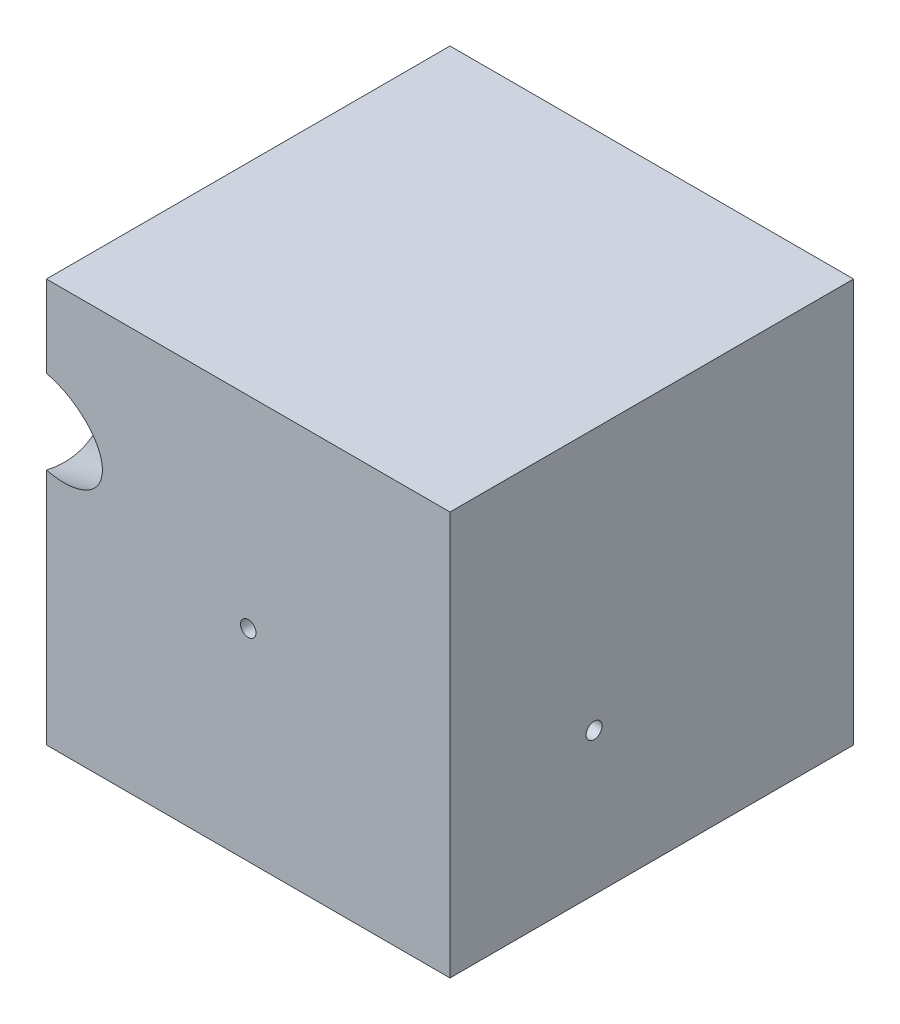
ISO-10303-21;
HEADER;
FILE_DESCRIPTION(('STEP AP214'),'2;1');
FILE_NAME('part.step','',(''),(''),'','','');
FILE_SCHEMA(('AUTOMOTIVE_DESIGN { 1 0 10303 214 1 1 1 1 }'));
ENDSEC;
DATA;
#1=APPLICATION_CONTEXT('core data for automotive mechanical design processes');
#2=APPLICATION_PROTOCOL_DEFINITION('international standard','automotive_design',2000,#1);
#3=PRODUCT_CONTEXT('',#1,'mechanical');
#4=PRODUCT('Part','Part','',(#3));
#5=PRODUCT_RELATED_PRODUCT_CATEGORY('part','',(#4));
#6=PRODUCT_DEFINITION_FORMATION('','',#4);
#7=PRODUCT_DEFINITION_CONTEXT('part definition',#1,'design');
#8=PRODUCT_DEFINITION('design','',#6,#7);
#9=PRODUCT_DEFINITION_SHAPE('','',#8);
#10=(LENGTH_UNIT() NAMED_UNIT(*) SI_UNIT(.MILLI.,.METRE.));
#11=(NAMED_UNIT(*) PLANE_ANGLE_UNIT() SI_UNIT($,.RADIAN.));
#12=(NAMED_UNIT(*) SI_UNIT($,.STERADIAN.) SOLID_ANGLE_UNIT());
#13=UNCERTAINTY_MEASURE_WITH_UNIT(LENGTH_MEASURE(1.E-05),#10,'distance_accuracy_value','');
#14=(GEOMETRIC_REPRESENTATION_CONTEXT(3) GLOBAL_UNCERTAINTY_ASSIGNED_CONTEXT((#13)) GLOBAL_UNIT_ASSIGNED_CONTEXT((#10,
#11,#12)) REPRESENTATION_CONTEXT('',''));
#15=CARTESIAN_POINT('',(0.,0.,0.));
#16=DIRECTION('',(0.,0.,1.));
#17=DIRECTION('',(1.,0.,0.));
#18=AXIS2_PLACEMENT_3D('',#15,#16,#17);
#19=CARTESIAN_POINT('',(26.,-26.,52.));
#20=DIRECTION('',(-1.,0.,0.));
#21=DIRECTION('',(0.,0.,1.));
#22=AXIS2_PLACEMENT_3D('',#19,#20,#21);
#23=PLANE('',#22);
#24=CARTESIAN_POINT('',(26.,-7.65059971868936,33.4398847970418));
#25=DIRECTION('',(1.,0.,0.));
#26=DIRECTION('',(0.,0.,-1.));
#27=AXIS2_PLACEMENT_3D('',#24,#25,#26);
#28=CIRCLE('',#27,1.03066779328189);
#29=CARTESIAN_POINT('',(26.,-7.65059971868936,32.4092170037599));
#30=VERTEX_POINT('',#29);
#31=EDGE_CURVE('E157',#30,#30,#28,.T.);
#32=ORIENTED_EDGE('',*,*,#31,.F.);
#33=EDGE_LOOP('',(#32));
#34=FACE_BOUND('',#33,.T.);
#35=DIRECTION('',(0.,1.,0.));
#36=VECTOR('',#35,1.);
#37=CARTESIAN_POINT('',(26.,-26.,0.));
#38=LINE('',#37,#36);
#39=CARTESIAN_POINT('',(26.,-26.,0.));
#40=VERTEX_POINT('',#39);
#41=CARTESIAN_POINT('',(26.,26.,0.));
#42=VERTEX_POINT('',#41);
#43=EDGE_CURVE('E98',#40,#42,#38,.T.);
#44=ORIENTED_EDGE('',*,*,#43,.T.);
#45=DIRECTION('',(0.,0.,-1.));
#46=VECTOR('',#45,1.);
#47=CARTESIAN_POINT('',(26.,26.,52.));
#48=LINE('',#47,#46);
#49=CARTESIAN_POINT('',(26.,26.,52.));
#50=VERTEX_POINT('',#49);
#51=EDGE_CURVE('E43',#50,#42,#48,.T.);
#52=ORIENTED_EDGE('',*,*,#51,.F.);
#53=DIRECTION('',(0.,1.,0.));
#54=VECTOR('',#53,1.);
#55=CARTESIAN_POINT('',(26.,-26.,52.));
#56=LINE('',#55,#54);
#57=CARTESIAN_POINT('',(26.,-26.,52.));
#58=VERTEX_POINT('',#57);
#59=EDGE_CURVE('E115',#58,#50,#56,.T.);
#60=ORIENTED_EDGE('',*,*,#59,.F.);
#61=DIRECTION('',(0.,0.,-1.));
#62=VECTOR('',#61,1.);
#63=CARTESIAN_POINT('',(26.,-26.,52.));
#64=LINE('',#63,#62);
#65=EDGE_CURVE('E103',#58,#40,#64,.T.);
#66=ORIENTED_EDGE('',*,*,#65,.T.);
#67=EDGE_LOOP('',(#44,#52,#60,#66));
#68=FACE_BOUND('',#67,.T.);
#69=ADVANCED_FACE('F36',(#34,#68),#23,.F.);
#70=CARTESIAN_POINT('',(-26.,26.,52.));
#71=DIRECTION('',(0.,-1.,0.));
#72=DIRECTION('',(0.,0.,-1.));
#73=AXIS2_PLACEMENT_3D('',#70,#71,#72);
#74=PLANE('',#73);
#75=DIRECTION('',(-1.,0.,0.));
#76=VECTOR('',#75,1.);
#77=CARTESIAN_POINT('',(-26.,26.,0.));
#78=LINE('',#77,#76);
#79=CARTESIAN_POINT('',(-26.,26.,0.));
#80=VERTEX_POINT('',#79);
#81=EDGE_CURVE('E110',#42,#80,#78,.T.);
#82=ORIENTED_EDGE('',*,*,#81,.T.);
#83=DIRECTION('',(0.,0.,-1.));
#84=VECTOR('',#83,1.);
#85=CARTESIAN_POINT('',(-26.,26.,52.));
#86=LINE('',#85,#84);
#87=CARTESIAN_POINT('',(-26.,26.,52.));
#88=VERTEX_POINT('',#87);
#89=EDGE_CURVE('E119',#88,#80,#86,.T.);
#90=ORIENTED_EDGE('',*,*,#89,.F.);
#91=DIRECTION('',(-1.,0.,0.));
#92=VECTOR('',#91,1.);
#93=CARTESIAN_POINT('',(-26.,26.,52.));
#94=LINE('',#93,#92);
#95=EDGE_CURVE('E86',#50,#88,#94,.T.);
#96=ORIENTED_EDGE('',*,*,#95,.F.);
#97=ORIENTED_EDGE('',*,*,#51,.T.);
#98=EDGE_LOOP('',(#82,#90,#96,#97));
#99=FACE_BOUND('',#98,.T.);
#100=ADVANCED_FACE('F121',(#99),#74,.F.);
#101=CARTESIAN_POINT('',(-26.,-26.,52.));
#102=DIRECTION('',(1.,0.,0.));
#103=DIRECTION('',(0.,0.,-1.));
#104=AXIS2_PLACEMENT_3D('',#101,#102,#103);
#105=PLANE('',#104);
#106=CARTESIAN_POINT('',(-26.,15.4824932695756,10.5144089828936));
#107=DIRECTION('',(-1.,0.,0.));
#108=DIRECTION('',(0.,0.,1.));
#109=AXIS2_PLACEMENT_3D('',#106,#107,#108);
#110=CIRCLE('',#109,1.);
#111=CARTESIAN_POINT('',(-26.,15.4824932695756,11.5144089828936));
#112=VERTEX_POINT('',#111);
#113=EDGE_CURVE('E152',#112,#112,#110,.T.);
#114=ORIENTED_EDGE('',*,*,#113,.F.);
#115=EDGE_LOOP('',(#114));
#116=FACE_BOUND('',#115,.T.);
#117=CARTESIAN_POINT('',(-26.,-13.8145900133681,20.4493109872581));
#118=DIRECTION('',(-1.,0.,0.));
#119=DIRECTION('',(0.,0.,1.));
#120=AXIS2_PLACEMENT_3D('',#117,#118,#119);
#121=CIRCLE('',#120,1.);
#122=CARTESIAN_POINT('',(-26.,-13.8145900133681,21.4493109872581));
#123=VERTEX_POINT('',#122);
#124=EDGE_CURVE('E145',#123,#123,#121,.T.);
#125=ORIENTED_EDGE('',*,*,#124,.F.);
#126=EDGE_LOOP('',(#125));
#127=FACE_BOUND('',#126,.T.);
#128=DIRECTION('',(0.,-1.,0.));
#129=VECTOR('',#128,1.);
#130=CARTESIAN_POINT('',(-26.,-26.,52.));
#131=LINE('',#130,#129);
#132=CARTESIAN_POINT('',(-26.,4.68073054722557,52.));
#133=VERTEX_POINT('',#132);
#134=CARTESIAN_POINT('',(-26.,-26.,52.));
#135=VERTEX_POINT('',#134);
#136=EDGE_CURVE('E97',#133,#135,#131,.T.);
#137=ORIENTED_EDGE('',*,*,#136,.F.);
#138=CARTESIAN_POINT('',(-26.,10.0900974233027,52.));
#139=DIRECTION('',(1.,0.,0.));
#140=DIRECTION('',(0.,-0.447213595499958,-0.894427190999916));
#141=AXIS2_PLACEMENT_3D('',#138,#139,#140);
#142=ELLIPSE('',#141,7.65,5.1);
#143=CARTESIAN_POINT('',(-26.,15.4994642993798,52.));
#144=VERTEX_POINT('',#143);
#145=EDGE_CURVE('E49',#133,#144,#142,.T.);
#146=ORIENTED_EDGE('',*,*,#145,.T.);
#147=EDGE_CURVE('E95',#88,#144,#131,.T.);
#148=ORIENTED_EDGE('',*,*,#147,.F.);
#149=ORIENTED_EDGE('',*,*,#89,.T.);
#150=DIRECTION('',(0.,-1.,0.));
#151=VECTOR('',#150,1.);
#152=CARTESIAN_POINT('',(-26.,-26.,0.));
#153=LINE('',#152,#151);
#154=CARTESIAN_POINT('',(-26.,-26.,0.));
#155=VERTEX_POINT('',#154);
#156=EDGE_CURVE('E112',#80,#155,#153,.T.);
#157=ORIENTED_EDGE('',*,*,#156,.T.);
#158=DIRECTION('',(0.,0.,-1.));
#159=VECTOR('',#158,1.);
#160=CARTESIAN_POINT('',(-26.,-26.,52.));
#161=LINE('',#160,#159);
#162=EDGE_CURVE('E117',#135,#155,#161,.T.);
#163=ORIENTED_EDGE('',*,*,#162,.F.);
#164=EDGE_LOOP('',(#137,#146,#148,#149,#157,#163));
#165=FACE_BOUND('',#164,.T.);
#166=ADVANCED_FACE('F93',(#116,#127,#165),#105,.F.);
#167=CARTESIAN_POINT('',(-26.,-26.,52.));
#168=DIRECTION('',(0.,1.,0.));
#169=DIRECTION('',(0.,0.,1.));
#170=AXIS2_PLACEMENT_3D('',#167,#168,#169);
#171=PLANE('',#170);
#172=CARTESIAN_POINT('',(-9.,-26.,44.28));
#173=DIRECTION('',(0.,-1.,0.));
#174=DIRECTION('',(0.,0.,-1.));
#175=AXIS2_PLACEMENT_3D('',#172,#173,#174);
#176=CIRCLE('',#175,1.);
#177=CARTESIAN_POINT('',(-9.,-26.,43.28));
#178=VERTEX_POINT('',#177);
#179=EDGE_CURVE('E163',#178,#178,#176,.T.);
#180=ORIENTED_EDGE('',*,*,#179,.F.);
#181=EDGE_LOOP('',(#180));
#182=FACE_BOUND('',#181,.T.);
#183=DIRECTION('',(1.,0.,0.));
#184=VECTOR('',#183,1.);
#185=CARTESIAN_POINT('',(-26.,-26.,0.));
#186=LINE('',#185,#184);
#187=EDGE_CURVE('E78',#155,#40,#186,.T.);
#188=ORIENTED_EDGE('',*,*,#187,.T.);
#189=ORIENTED_EDGE('',*,*,#65,.F.);
#190=DIRECTION('',(1.,0.,0.));
#191=VECTOR('',#190,1.);
#192=CARTESIAN_POINT('',(-26.,-26.,52.));
#193=LINE('',#192,#191);
#194=EDGE_CURVE('E57',#135,#58,#193,.T.);
#195=ORIENTED_EDGE('',*,*,#194,.F.);
#196=ORIENTED_EDGE('',*,*,#162,.T.);
#197=EDGE_LOOP('',(#188,#189,#195,#196));
#198=FACE_BOUND('',#197,.T.);
#199=ADVANCED_FACE('F128',(#182,#198),#171,.F.);
#200=CARTESIAN_POINT('',(0.,0.,52.));
#201=DIRECTION('',(0.,0.,-1.));
#202=DIRECTION('',(-1.,0.,0.));
#203=AXIS2_PLACEMENT_3D('',#200,#201,#202);
#204=PLANE('',#203);
#205=CARTESIAN_POINT('',(0.,0.,52.));
#206=DIRECTION('',(0.,0.,1.));
#207=DIRECTION('',(1.,0.,0.));
#208=AXIS2_PLACEMENT_3D('',#205,#206,#207);
#209=CIRCLE('',#208,1.);
#210=CARTESIAN_POINT('',(1.,0.,52.));
#211=VERTEX_POINT('',#210);
#212=EDGE_CURVE('E133',#211,#211,#209,.T.);
#213=ORIENTED_EDGE('',*,*,#212,.F.);
#214=EDGE_LOOP('',(#213));
#215=FACE_BOUND('',#214,.T.);
#216=ORIENTED_EDGE('',*,*,#147,.T.);
#217=CARTESIAN_POINT('',(-26.,10.0900974233027,52.));
#218=DIRECTION('',(0.,0.,-1.));
#219=DIRECTION('',(0.894427190999916,-0.447213595499958,0.));
#220=AXIS2_PLACEMENT_3D('',#217,#218,#219);
#221=ELLIPSE('',#220,7.65,5.1);
#222=EDGE_CURVE('E11',#144,#133,#221,.T.);
#223=ORIENTED_EDGE('',*,*,#222,.T.);
#224=ORIENTED_EDGE('',*,*,#136,.T.);
#225=ORIENTED_EDGE('',*,*,#194,.T.);
#226=ORIENTED_EDGE('',*,*,#59,.T.);
#227=ORIENTED_EDGE('',*,*,#95,.T.);
#228=EDGE_LOOP('',(#216,#223,#224,#225,#226,#227));
#229=FACE_BOUND('',#228,.T.);
#230=ADVANCED_FACE('F101',(#215,#229),#204,.F.);
#231=CARTESIAN_POINT('',(0.,0.,0.));
#232=DIRECTION('',(0.,0.,-1.));
#233=DIRECTION('',(-1.,0.,0.));
#234=AXIS2_PLACEMENT_3D('',#231,#232,#233);
#235=PLANE('',#234);
#236=CARTESIAN_POINT('',(0.,0.,0.));
#237=DIRECTION('',(0.,0.,-1.));
#238=DIRECTION('',(-1.,0.,0.));
#239=AXIS2_PLACEMENT_3D('',#236,#237,#238);
#240=CIRCLE('',#239,1.);
#241=CARTESIAN_POINT('',(-1.,0.,0.));
#242=VERTEX_POINT('',#241);
#243=EDGE_CURVE('E139',#242,#242,#240,.T.);
#244=ORIENTED_EDGE('',*,*,#243,.F.);
#245=EDGE_LOOP('',(#244));
#246=FACE_BOUND('',#245,.T.);
#247=ORIENTED_EDGE('',*,*,#43,.F.);
#248=ORIENTED_EDGE('',*,*,#187,.F.);
#249=ORIENTED_EDGE('',*,*,#156,.F.);
#250=ORIENTED_EDGE('',*,*,#81,.F.);
#251=EDGE_LOOP('',(#247,#248,#249,#250));
#252=FACE_BOUND('',#251,.T.);
#253=ADVANCED_FACE('F126',(#246,#252),#235,.T.);
#254=CARTESIAN_POINT('',(-29.5355339059327,11.857864376269,55.5355339059327));
#255=DIRECTION('',(0.666666666666667,-0.333333333333333,-0.666666666666667));
#256=DIRECTION('',(-0.707106781186548,0.,-0.707106781186548));
#257=AXIS2_PLACEMENT_3D('',#254,#255,#256);
#258=CYLINDRICAL_SURFACE('',#257,5.1);
#259=CARTESIAN_POINT('',(-7.97997835037718,1.08008659849128,33.9799783503772));
#260=DIRECTION('',(0.666666666666667,-0.333333333333333,-0.666666666666667));
#261=DIRECTION('',(-0.707106781186548,0.,-0.707106781186548));
#262=AXIS2_PLACEMENT_3D('',#259,#260,#261);
#263=CIRCLE('',#262,5.1);
#264=CARTESIAN_POINT('',(-11.5862229344286,1.08008659849128,30.3737337663258));
#265=VERTEX_POINT('',#264);
#266=EDGE_CURVE('E99',#265,#265,#263,.T.);
#267=ORIENTED_EDGE('',*,*,#266,.T.);
#268=EDGE_LOOP('',(#267));
#269=FACE_BOUND('',#268,.T.);
#270=ORIENTED_EDGE('',*,*,#222,.F.);
#271=ORIENTED_EDGE('',*,*,#145,.F.);
#272=EDGE_LOOP('',(#270,#271));
#273=FACE_BOUND('',#272,.T.);
#274=ADVANCED_FACE('F88',(#269,#273),#258,.F.);
#275=CARTESIAN_POINT('',(-7.97997835037718,1.08008659849128,33.9799783503772));
#276=DIRECTION('',(0.666666666666667,-0.333333333333333,-0.666666666666667));
#277=DIRECTION('',(-0.707106781186548,0.,-0.707106781186548));
#278=AXIS2_PLACEMENT_3D('',#275,#276,#277);
#279=PLANE('',#278);
#280=ORIENTED_EDGE('',*,*,#266,.F.);
#281=EDGE_LOOP('',(#280));
#282=FACE_BOUND('',#281,.T.);
#283=ADVANCED_FACE('F238',(#282),#279,.F.);
#284=CARTESIAN_POINT('',(0.,0.,40.));
#285=DIRECTION('',(0.,0.,1.));
#286=DIRECTION('',(1.,0.,0.));
#287=AXIS2_PLACEMENT_3D('',#284,#285,#286);
#288=CYLINDRICAL_SURFACE('',#287,1.);
#289=CARTESIAN_POINT('',(0.,0.,40.));
#290=DIRECTION('',(0.,0.,1.));
#291=DIRECTION('',(1.,0.,0.));
#292=AXIS2_PLACEMENT_3D('',#289,#290,#291);
#293=CIRCLE('',#292,1.);
#294=CARTESIAN_POINT('',(1.,0.,40.));
#295=VERTEX_POINT('',#294);
#296=EDGE_CURVE('E132',#295,#295,#293,.T.);
#297=ORIENTED_EDGE('',*,*,#296,.F.);
#298=EDGE_LOOP('',(#297));
#299=FACE_BOUND('',#298,.T.);
#300=ORIENTED_EDGE('',*,*,#212,.T.);
#301=EDGE_LOOP('',(#300));
#302=FACE_BOUND('',#301,.T.);
#303=ADVANCED_FACE('F234',(#299,#302),#288,.F.);
#304=CARTESIAN_POINT('',(0.,0.,40.));
#305=DIRECTION('',(0.,0.,1.));
#306=DIRECTION('',(1.,0.,0.));
#307=AXIS2_PLACEMENT_3D('',#304,#305,#306);
#308=PLANE('',#307);
#309=ORIENTED_EDGE('',*,*,#296,.T.);
#310=EDGE_LOOP('',(#309));
#311=FACE_BOUND('',#310,.T.);
#312=ADVANCED_FACE('F230',(#311),#308,.T.);
#313=CARTESIAN_POINT('',(0.,0.,12.));
#314=DIRECTION('',(0.,0.,-1.));
#315=DIRECTION('',(-1.,0.,0.));
#316=AXIS2_PLACEMENT_3D('',#313,#314,#315);
#317=CYLINDRICAL_SURFACE('',#316,1.);
#318=CARTESIAN_POINT('',(0.,0.,12.));
#319=DIRECTION('',(0.,0.,-1.));
#320=DIRECTION('',(-1.,0.,0.));
#321=AXIS2_PLACEMENT_3D('',#318,#319,#320);
#322=CIRCLE('',#321,1.);
#323=CARTESIAN_POINT('',(-1.,0.,12.));
#324=VERTEX_POINT('',#323);
#325=EDGE_CURVE('E136',#324,#324,#322,.T.);
#326=ORIENTED_EDGE('',*,*,#325,.F.);
#327=EDGE_LOOP('',(#326));
#328=FACE_BOUND('',#327,.T.);
#329=ORIENTED_EDGE('',*,*,#243,.T.);
#330=EDGE_LOOP('',(#329));
#331=FACE_BOUND('',#330,.T.);
#332=ADVANCED_FACE('F226',(#328,#331),#317,.F.);
#333=CARTESIAN_POINT('',(0.,0.,12.));
#334=DIRECTION('',(0.,0.,-1.));
#335=DIRECTION('',(-1.,0.,0.));
#336=AXIS2_PLACEMENT_3D('',#333,#334,#335);
#337=PLANE('',#336);
#338=ORIENTED_EDGE('',*,*,#325,.T.);
#339=EDGE_LOOP('',(#338));
#340=FACE_BOUND('',#339,.T.);
#341=ADVANCED_FACE('F222',(#340),#337,.T.);
#342=CARTESIAN_POINT('',(-14.,-13.8145900133681,20.4493109872581));
#343=DIRECTION('',(-1.,0.,0.));
#344=DIRECTION('',(0.,0.,1.));
#345=AXIS2_PLACEMENT_3D('',#342,#343,#344);
#346=CYLINDRICAL_SURFACE('',#345,1.);
#347=CARTESIAN_POINT('',(-14.,-13.8145900133681,20.4493109872581));
#348=DIRECTION('',(-1.,0.,0.));
#349=DIRECTION('',(0.,0.,1.));
#350=AXIS2_PLACEMENT_3D('',#347,#348,#349);
#351=CIRCLE('',#350,1.);
#352=CARTESIAN_POINT('',(-14.,-13.8145900133681,21.4493109872581));
#353=VERTEX_POINT('',#352);
#354=EDGE_CURVE('E148',#353,#353,#351,.T.);
#355=ORIENTED_EDGE('',*,*,#354,.F.);
#356=EDGE_LOOP('',(#355));
#357=FACE_BOUND('',#356,.T.);
#358=ORIENTED_EDGE('',*,*,#124,.T.);
#359=EDGE_LOOP('',(#358));
#360=FACE_BOUND('',#359,.T.);
#361=ADVANCED_FACE('F218',(#357,#360),#346,.F.);
#362=CARTESIAN_POINT('',(-14.,-13.8145900133681,20.4493109872581));
#363=DIRECTION('',(-1.,0.,0.));
#364=DIRECTION('',(0.,0.,1.));
#365=AXIS2_PLACEMENT_3D('',#362,#363,#364);
#366=PLANE('',#365);
#367=ORIENTED_EDGE('',*,*,#354,.T.);
#368=EDGE_LOOP('',(#367));
#369=FACE_BOUND('',#368,.T.);
#370=ADVANCED_FACE('F214',(#369),#366,.T.);
#371=CARTESIAN_POINT('',(-14.,15.4824932695756,10.5144089828936));
#372=DIRECTION('',(-1.,0.,0.));
#373=DIRECTION('',(0.,0.,1.));
#374=AXIS2_PLACEMENT_3D('',#371,#372,#373);
#375=CYLINDRICAL_SURFACE('',#374,1.);
#376=CARTESIAN_POINT('',(-14.,15.4824932695756,10.5144089828936));
#377=DIRECTION('',(-1.,0.,0.));
#378=DIRECTION('',(0.,0.,1.));
#379=AXIS2_PLACEMENT_3D('',#376,#377,#378);
#380=CIRCLE('',#379,1.);
#381=CARTESIAN_POINT('',(-14.,15.4824932695756,11.5144089828936));
#382=VERTEX_POINT('',#381);
#383=EDGE_CURVE('E142',#382,#382,#380,.T.);
#384=ORIENTED_EDGE('',*,*,#383,.F.);
#385=EDGE_LOOP('',(#384));
#386=FACE_BOUND('',#385,.T.);
#387=ORIENTED_EDGE('',*,*,#113,.T.);
#388=EDGE_LOOP('',(#387));
#389=FACE_BOUND('',#388,.T.);
#390=ADVANCED_FACE('F207',(#386,#389),#375,.F.);
#391=CARTESIAN_POINT('',(-14.,15.4824932695756,10.5144089828936));
#392=DIRECTION('',(-1.,0.,0.));
#393=DIRECTION('',(0.,0.,1.));
#394=AXIS2_PLACEMENT_3D('',#391,#392,#393);
#395=PLANE('',#394);
#396=ORIENTED_EDGE('',*,*,#383,.T.);
#397=EDGE_LOOP('',(#396));
#398=FACE_BOUND('',#397,.T.);
#399=ADVANCED_FACE('F198',(#398),#395,.T.);
#400=CARTESIAN_POINT('',(14.,-7.65059971868936,33.4398847970418));
#401=DIRECTION('',(1.,0.,0.));
#402=DIRECTION('',(0.,0.,-1.));
#403=AXIS2_PLACEMENT_3D('',#400,#401,#402);
#404=CYLINDRICAL_SURFACE('',#403,1.03066779328189);
#405=CARTESIAN_POINT('',(14.,-7.65059971868936,33.4398847970418));
#406=DIRECTION('',(1.,0.,0.));
#407=DIRECTION('',(0.,0.,-1.));
#408=AXIS2_PLACEMENT_3D('',#405,#406,#407);
#409=CIRCLE('',#408,1.03066779328189);
#410=CARTESIAN_POINT('',(14.,-7.65059971868936,32.4092170037599));
#411=VERTEX_POINT('',#410);
#412=EDGE_CURVE('E149',#411,#411,#409,.T.);
#413=ORIENTED_EDGE('',*,*,#412,.F.);
#414=EDGE_LOOP('',(#413));
#415=FACE_BOUND('',#414,.T.);
#416=ORIENTED_EDGE('',*,*,#31,.T.);
#417=EDGE_LOOP('',(#416));
#418=FACE_BOUND('',#417,.T.);
#419=ADVANCED_FACE('F196',(#415,#418),#404,.F.);
#420=CARTESIAN_POINT('',(14.,-7.65059971868936,33.4398847970418));
#421=DIRECTION('',(1.,0.,0.));
#422=DIRECTION('',(0.,0.,-1.));
#423=AXIS2_PLACEMENT_3D('',#420,#421,#422);
#424=PLANE('',#423);
#425=ORIENTED_EDGE('',*,*,#412,.T.);
#426=EDGE_LOOP('',(#425));
#427=FACE_BOUND('',#426,.T.);
#428=ADVANCED_FACE('F174',(#427),#424,.T.);
#429=CARTESIAN_POINT('',(-9.,-14.,44.28));
#430=DIRECTION('',(0.,-1.,0.));
#431=DIRECTION('',(0.,0.,-1.));
#432=AXIS2_PLACEMENT_3D('',#429,#430,#431);
#433=CYLINDRICAL_SURFACE('',#432,1.);
#434=CARTESIAN_POINT('',(-9.,-14.,44.28));
#435=DIRECTION('',(0.,-1.,0.));
#436=DIRECTION('',(0.,0.,-1.));
#437=AXIS2_PLACEMENT_3D('',#434,#435,#436);
#438=CIRCLE('',#437,1.);
#439=CARTESIAN_POINT('',(-9.,-14.,43.28));
#440=VERTEX_POINT('',#439);
#441=EDGE_CURVE('E160',#440,#440,#438,.T.);
#442=ORIENTED_EDGE('',*,*,#441,.F.);
#443=EDGE_LOOP('',(#442));
#444=FACE_BOUND('',#443,.T.);
#445=ORIENTED_EDGE('',*,*,#179,.T.);
#446=EDGE_LOOP('',(#445));
#447=FACE_BOUND('',#446,.T.);
#448=ADVANCED_FACE('F171',(#444,#447),#433,.F.);
#449=CARTESIAN_POINT('',(-9.,-14.,44.28));
#450=DIRECTION('',(0.,-1.,0.));
#451=DIRECTION('',(0.,0.,-1.));
#452=AXIS2_PLACEMENT_3D('',#449,#450,#451);
#453=PLANE('',#452);
#454=ORIENTED_EDGE('',*,*,#441,.T.);
#455=EDGE_LOOP('',(#454));
#456=FACE_BOUND('',#455,.T.);
#457=ADVANCED_FACE('F169',(#456),#453,.T.);
#458=CLOSED_SHELL('',(#69,#100,#166,#199,#230,#253,#274,#283,#303,#312,#332,#341,#361,#370,#390,
#399,#419,#428,#448,#457));
#459=MANIFOLD_SOLID_BREP('B2',#458);
#460=ADVANCED_BREP_SHAPE_REPRESENTATION('',(#18,#459),#14);
#461=SHAPE_DEFINITION_REPRESENTATION(#9,#460);
ENDSEC;
END-ISO-10303-21;
